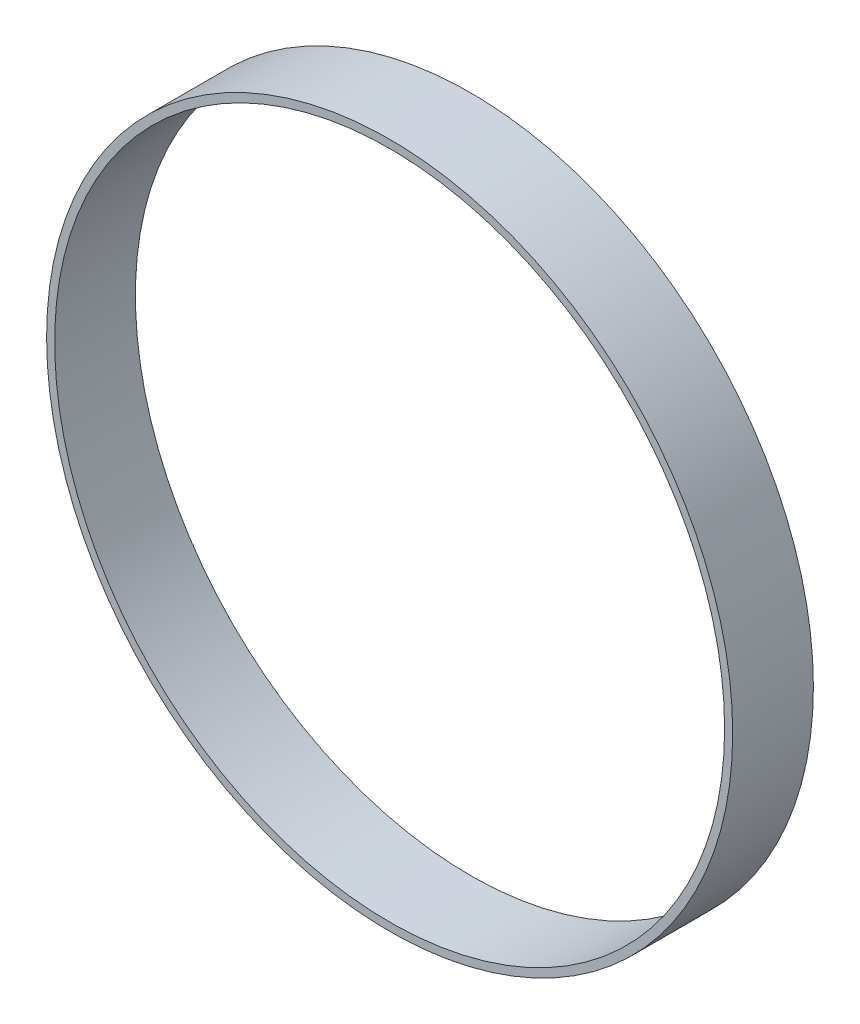
ISO-10303-21;
HEADER;
FILE_DESCRIPTION(('STEP AP214'),'2;1');
FILE_NAME('part.step','',(''),(''),'','','');
FILE_SCHEMA(('AUTOMOTIVE_DESIGN { 1 0 10303 214 1 1 1 1 }'));
ENDSEC;
DATA;
#1=APPLICATION_CONTEXT('core data for automotive mechanical design processes');
#2=APPLICATION_PROTOCOL_DEFINITION('international standard','automotive_design',2000,#1);
#3=PRODUCT_CONTEXT('',#1,'mechanical');
#4=PRODUCT('Part','Part','',(#3));
#5=PRODUCT_RELATED_PRODUCT_CATEGORY('part','',(#4));
#6=PRODUCT_DEFINITION_FORMATION('','',#4);
#7=PRODUCT_DEFINITION_CONTEXT('part definition',#1,'design');
#8=PRODUCT_DEFINITION('design','',#6,#7);
#9=PRODUCT_DEFINITION_SHAPE('','',#8);
#10=(LENGTH_UNIT() NAMED_UNIT(*) SI_UNIT(.MILLI.,.METRE.));
#11=(NAMED_UNIT(*) PLANE_ANGLE_UNIT() SI_UNIT($,.RADIAN.));
#12=(NAMED_UNIT(*) SI_UNIT($,.STERADIAN.) SOLID_ANGLE_UNIT());
#13=UNCERTAINTY_MEASURE_WITH_UNIT(LENGTH_MEASURE(1.E-05),#10,'distance_accuracy_value','');
#14=(GEOMETRIC_REPRESENTATION_CONTEXT(3) GLOBAL_UNCERTAINTY_ASSIGNED_CONTEXT((#13)) GLOBAL_UNIT_ASSIGNED_CONTEXT((#10,
#11,#12)) REPRESENTATION_CONTEXT('',''));
#15=CARTESIAN_POINT('',(0.,0.,0.));
#16=DIRECTION('',(0.,0.,1.));
#17=DIRECTION('',(1.,0.,0.));
#18=AXIS2_PLACEMENT_3D('',#15,#16,#17);
#19=CARTESIAN_POINT('',(0.,0.,20.));
#20=DIRECTION('',(0.,0.,1.));
#21=DIRECTION('',(1.,0.,0.));
#22=AXIS2_PLACEMENT_3D('',#19,#20,#21);
#23=PLANE('',#22);
#24=CARTESIAN_POINT('',(0.,0.,20.));
#25=DIRECTION('',(0.,0.,1.));
#26=DIRECTION('',(1.,0.,0.));
#27=AXIS2_PLACEMENT_3D('',#24,#25,#26);
#28=CIRCLE('',#27,85.);
#29=CARTESIAN_POINT('',(85.,0.,20.));
#30=VERTEX_POINT('',#29);
#31=EDGE_CURVE('E10',#30,#30,#28,.T.);
#32=ORIENTED_EDGE('',*,*,#31,.T.);
#33=EDGE_LOOP('',(#32));
#34=FACE_BOUND('',#33,.T.);
#35=CARTESIAN_POINT('',(0.,0.,20.));
#36=DIRECTION('',(0.,0.,1.));
#37=DIRECTION('',(1.,0.,0.));
#38=AXIS2_PLACEMENT_3D('',#35,#36,#37);
#39=CIRCLE('',#38,83.);
#40=CARTESIAN_POINT('',(83.,0.,20.));
#41=VERTEX_POINT('',#40);
#42=EDGE_CURVE('E50',#41,#41,#39,.T.);
#43=ORIENTED_EDGE('',*,*,#42,.F.);
#44=EDGE_LOOP('',(#43));
#45=FACE_BOUND('',#44,.T.);
#46=ADVANCED_FACE('F37',(#34,#45),#23,.T.);
#47=CARTESIAN_POINT('',(0.,0.,0.));
#48=DIRECTION('',(0.,0.,1.));
#49=DIRECTION('',(1.,0.,0.));
#50=AXIS2_PLACEMENT_3D('',#47,#48,#49);
#51=PLANE('',#50);
#52=CARTESIAN_POINT('',(0.,0.,0.));
#53=DIRECTION('',(0.,0.,1.));
#54=DIRECTION('',(1.,0.,0.));
#55=AXIS2_PLACEMENT_3D('',#52,#53,#54);
#56=CIRCLE('',#55,85.);
#57=CARTESIAN_POINT('',(85.,0.,0.));
#58=VERTEX_POINT('',#57);
#59=EDGE_CURVE('E41',#58,#58,#56,.T.);
#60=ORIENTED_EDGE('',*,*,#59,.F.);
#61=EDGE_LOOP('',(#60));
#62=FACE_BOUND('',#61,.T.);
#63=CARTESIAN_POINT('',(0.,0.,0.));
#64=DIRECTION('',(0.,0.,1.));
#65=DIRECTION('',(1.,0.,0.));
#66=AXIS2_PLACEMENT_3D('',#63,#64,#65);
#67=CIRCLE('',#66,83.);
#68=CARTESIAN_POINT('',(83.,0.,0.));
#69=VERTEX_POINT('',#68);
#70=EDGE_CURVE('E52',#69,#69,#67,.T.);
#71=ORIENTED_EDGE('',*,*,#70,.T.);
#72=EDGE_LOOP('',(#71));
#73=FACE_BOUND('',#72,.T.);
#74=ADVANCED_FACE('F64',(#62,#73),#51,.F.);
#75=CARTESIAN_POINT('',(0.,0.,20.));
#76=DIRECTION('',(0.,0.,-1.));
#77=DIRECTION('',(-1.,0.,0.));
#78=AXIS2_PLACEMENT_3D('',#75,#76,#77);
#79=CYLINDRICAL_SURFACE('',#78,85.);
#80=ORIENTED_EDGE('',*,*,#31,.F.);
#81=EDGE_LOOP('',(#80));
#82=FACE_BOUND('',#81,.T.);
#83=ORIENTED_EDGE('',*,*,#59,.T.);
#84=EDGE_LOOP('',(#83));
#85=FACE_BOUND('',#84,.T.);
#86=ADVANCED_FACE('F39',(#82,#85),#79,.T.);
#87=CARTESIAN_POINT('',(0.,0.,20.));
#88=DIRECTION('',(0.,0.,-1.));
#89=DIRECTION('',(-1.,0.,0.));
#90=AXIS2_PLACEMENT_3D('',#87,#88,#89);
#91=CYLINDRICAL_SURFACE('',#90,83.);
#92=ORIENTED_EDGE('',*,*,#42,.T.);
#93=EDGE_LOOP('',(#92));
#94=FACE_BOUND('',#93,.T.);
#95=ORIENTED_EDGE('',*,*,#70,.F.);
#96=EDGE_LOOP('',(#95));
#97=FACE_BOUND('',#96,.T.);
#98=ADVANCED_FACE('F60',(#94,#97),#91,.F.);
#99=CLOSED_SHELL('',(#46,#74,#86,#98));
#100=MANIFOLD_SOLID_BREP('B2',#99);
#101=ADVANCED_BREP_SHAPE_REPRESENTATION('',(#18,#100),#14);
#102=SHAPE_DEFINITION_REPRESENTATION(#9,#101);
ENDSEC;
END-ISO-10303-21;
